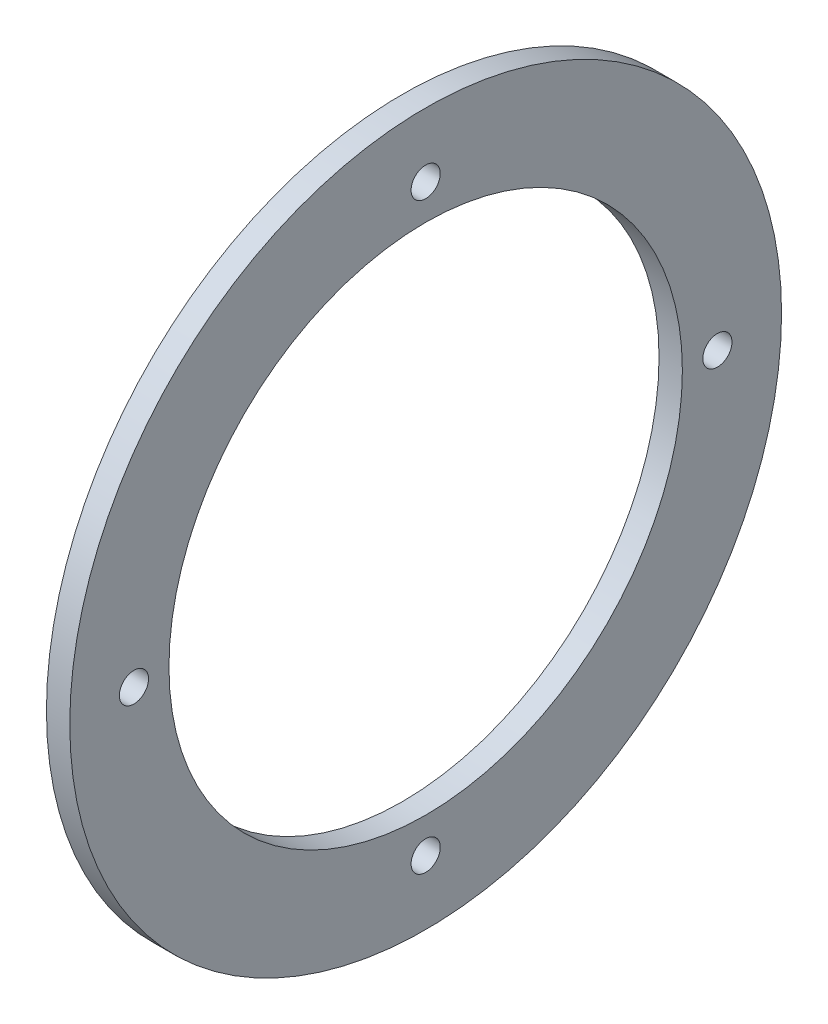
ISO-10303-21;
HEADER;
FILE_DESCRIPTION(('STEP AP214'),'2;1');
FILE_NAME('part.step','',(''),(''),'','','');
FILE_SCHEMA(('AUTOMOTIVE_DESIGN { 1 0 10303 214 1 1 1 1 }'));
ENDSEC;
DATA;
#1=APPLICATION_CONTEXT('core data for automotive mechanical design processes');
#2=APPLICATION_PROTOCOL_DEFINITION('international standard','automotive_design',2000,#1);
#3=PRODUCT_CONTEXT('',#1,'mechanical');
#4=PRODUCT('Part','Part','',(#3));
#5=PRODUCT_RELATED_PRODUCT_CATEGORY('part','',(#4));
#6=PRODUCT_DEFINITION_FORMATION('','',#4);
#7=PRODUCT_DEFINITION_CONTEXT('part definition',#1,'design');
#8=PRODUCT_DEFINITION('design','',#6,#7);
#9=PRODUCT_DEFINITION_SHAPE('','',#8);
#10=(LENGTH_UNIT() NAMED_UNIT(*) SI_UNIT(.MILLI.,.METRE.));
#11=(NAMED_UNIT(*) PLANE_ANGLE_UNIT() SI_UNIT($,.RADIAN.));
#12=(NAMED_UNIT(*) SI_UNIT($,.STERADIAN.) SOLID_ANGLE_UNIT());
#13=UNCERTAINTY_MEASURE_WITH_UNIT(LENGTH_MEASURE(1.E-05),#10,'distance_accuracy_value','');
#14=(GEOMETRIC_REPRESENTATION_CONTEXT(3) GLOBAL_UNCERTAINTY_ASSIGNED_CONTEXT((#13)) GLOBAL_UNIT_ASSIGNED_CONTEXT((#10,
#11,#12)) REPRESENTATION_CONTEXT('',''));
#15=CARTESIAN_POINT('',(0.,0.,0.));
#16=DIRECTION('',(0.,0.,1.));
#17=DIRECTION('',(1.,0.,0.));
#18=AXIS2_PLACEMENT_3D('',#15,#16,#17);
#19=CARTESIAN_POINT('',(4.,0.,0.));
#20=DIRECTION('',(-1.,0.,0.));
#21=DIRECTION('',(0.,0.,1.));
#22=AXIS2_PLACEMENT_3D('',#19,#20,#21);
#23=CYLINDRICAL_SURFACE('',#22,61.);
#24=CARTESIAN_POINT('',(4.,0.,0.));
#25=DIRECTION('',(1.,0.,0.));
#26=DIRECTION('',(0.,0.,-1.));
#27=AXIS2_PLACEMENT_3D('',#24,#25,#26);
#28=CIRCLE('',#27,61.);
#29=CARTESIAN_POINT('',(4.,0.,-61.));
#30=VERTEX_POINT('',#29);
#31=EDGE_CURVE('E42',#30,#30,#28,.T.);
#32=ORIENTED_EDGE('',*,*,#31,.F.);
#33=EDGE_LOOP('',(#32));
#34=FACE_BOUND('',#33,.T.);
#35=CARTESIAN_POINT('',(0.,0.,0.));
#36=DIRECTION('',(1.,0.,0.));
#37=DIRECTION('',(0.,0.,-1.));
#38=AXIS2_PLACEMENT_3D('',#35,#36,#37);
#39=CIRCLE('',#38,61.);
#40=CARTESIAN_POINT('',(0.,0.,-61.));
#41=VERTEX_POINT('',#40);
#42=EDGE_CURVE('E62',#41,#41,#39,.T.);
#43=ORIENTED_EDGE('',*,*,#42,.T.);
#44=EDGE_LOOP('',(#43));
#45=FACE_BOUND('',#44,.T.);
#46=ADVANCED_FACE('F34',(#34,#45),#23,.T.);
#47=CARTESIAN_POINT('',(4.,0.,0.));
#48=DIRECTION('',(-1.,0.,0.));
#49=DIRECTION('',(0.,0.,1.));
#50=AXIS2_PLACEMENT_3D('',#47,#48,#49);
#51=CYLINDRICAL_SURFACE('',#50,44.);
#52=CARTESIAN_POINT('',(4.,0.,0.));
#53=DIRECTION('',(1.,0.,0.));
#54=DIRECTION('',(0.,0.,-1.));
#55=AXIS2_PLACEMENT_3D('',#52,#53,#54);
#56=CIRCLE('',#55,44.);
#57=CARTESIAN_POINT('',(4.,0.,-44.));
#58=VERTEX_POINT('',#57);
#59=EDGE_CURVE('E47',#58,#58,#56,.T.);
#60=ORIENTED_EDGE('',*,*,#59,.T.);
#61=EDGE_LOOP('',(#60));
#62=FACE_BOUND('',#61,.T.);
#63=CARTESIAN_POINT('',(0.,0.,0.));
#64=DIRECTION('',(1.,0.,0.));
#65=DIRECTION('',(0.,0.,-1.));
#66=AXIS2_PLACEMENT_3D('',#63,#64,#65);
#67=CIRCLE('',#66,44.);
#68=CARTESIAN_POINT('',(0.,0.,-44.));
#69=VERTEX_POINT('',#68);
#70=EDGE_CURVE('E60',#69,#69,#67,.T.);
#71=ORIENTED_EDGE('',*,*,#70,.F.);
#72=EDGE_LOOP('',(#71));
#73=FACE_BOUND('',#72,.T.);
#74=ADVANCED_FACE('F83',(#62,#73),#51,.F.);
#75=CARTESIAN_POINT('',(4.,50.,0.));
#76=DIRECTION('',(-1.,0.,0.));
#77=DIRECTION('',(0.,0.,1.));
#78=AXIS2_PLACEMENT_3D('',#75,#76,#77);
#79=CYLINDRICAL_SURFACE('',#78,2.49999999999997);
#80=CARTESIAN_POINT('',(4.,50.,0.));
#81=DIRECTION('',(1.,0.,0.));
#82=DIRECTION('',(0.,0.,-1.));
#83=AXIS2_PLACEMENT_3D('',#80,#81,#82);
#84=CIRCLE('',#83,2.49999999999997);
#85=CARTESIAN_POINT('',(4.,50.,-2.49999999999995));
#86=VERTEX_POINT('',#85);
#87=EDGE_CURVE('E76',#86,#86,#84,.F.);
#88=ORIENTED_EDGE('',*,*,#87,.F.);
#89=EDGE_LOOP('',(#88));
#90=FACE_BOUND('',#89,.T.);
#91=CARTESIAN_POINT('',(0.,50.,0.));
#92=DIRECTION('',(1.,0.,0.));
#93=DIRECTION('',(0.,0.,-1.));
#94=AXIS2_PLACEMENT_3D('',#91,#92,#93);
#95=CIRCLE('',#94,2.49999999999997);
#96=CARTESIAN_POINT('',(0.,50.,-2.49999999999995));
#97=VERTEX_POINT('',#96);
#98=EDGE_CURVE('E57',#97,#97,#95,.F.);
#99=ORIENTED_EDGE('',*,*,#98,.T.);
#100=EDGE_LOOP('',(#99));
#101=FACE_BOUND('',#100,.T.);
#102=ADVANCED_FACE('F100',(#90,#101),#79,.F.);
#103=CARTESIAN_POINT('',(4.,0.,-50.));
#104=DIRECTION('',(-1.,0.,0.));
#105=DIRECTION('',(0.,0.,1.));
#106=AXIS2_PLACEMENT_3D('',#103,#104,#105);
#107=CYLINDRICAL_SURFACE('',#106,2.49999999999999);
#108=CARTESIAN_POINT('',(4.,0.,-50.));
#109=DIRECTION('',(1.,0.,0.));
#110=DIRECTION('',(0.,0.,-1.));
#111=AXIS2_PLACEMENT_3D('',#108,#109,#110);
#112=CIRCLE('',#111,2.49999999999999);
#113=CARTESIAN_POINT('',(4.,0.,-52.5));
#114=VERTEX_POINT('',#113);
#115=EDGE_CURVE('E71',#114,#114,#112,.T.);
#116=ORIENTED_EDGE('',*,*,#115,.T.);
#117=EDGE_LOOP('',(#116));
#118=FACE_BOUND('',#117,.T.);
#119=CARTESIAN_POINT('',(0.,0.,-50.));
#120=DIRECTION('',(1.,0.,0.));
#121=DIRECTION('',(0.,0.,-1.));
#122=AXIS2_PLACEMENT_3D('',#119,#120,#121);
#123=CIRCLE('',#122,2.49999999999999);
#124=CARTESIAN_POINT('',(0.,0.,-52.5));
#125=VERTEX_POINT('',#124);
#126=EDGE_CURVE('E54',#125,#125,#123,.T.);
#127=ORIENTED_EDGE('',*,*,#126,.F.);
#128=EDGE_LOOP('',(#127));
#129=FACE_BOUND('',#128,.T.);
#130=ADVANCED_FACE('F106',(#118,#129),#107,.F.);
#131=CARTESIAN_POINT('',(4.,-50.,0.));
#132=DIRECTION('',(-1.,0.,0.));
#133=DIRECTION('',(0.,0.,1.));
#134=AXIS2_PLACEMENT_3D('',#131,#132,#133);
#135=CYLINDRICAL_SURFACE('',#134,2.5);
#136=CARTESIAN_POINT('',(4.,-50.,0.));
#137=DIRECTION('',(1.,0.,0.));
#138=DIRECTION('',(0.,0.,-1.));
#139=AXIS2_PLACEMENT_3D('',#136,#137,#138);
#140=CIRCLE('',#139,2.5);
#141=CARTESIAN_POINT('',(4.,-50.,-2.5));
#142=VERTEX_POINT('',#141);
#143=EDGE_CURVE('E67',#142,#142,#140,.T.);
#144=ORIENTED_EDGE('',*,*,#143,.T.);
#145=EDGE_LOOP('',(#144));
#146=FACE_BOUND('',#145,.T.);
#147=CARTESIAN_POINT('',(0.,-50.,0.));
#148=DIRECTION('',(1.,0.,0.));
#149=DIRECTION('',(0.,0.,-1.));
#150=AXIS2_PLACEMENT_3D('',#147,#148,#149);
#151=CIRCLE('',#150,2.5);
#152=CARTESIAN_POINT('',(0.,-50.,-2.5));
#153=VERTEX_POINT('',#152);
#154=EDGE_CURVE('E51',#153,#153,#151,.T.);
#155=ORIENTED_EDGE('',*,*,#154,.F.);
#156=EDGE_LOOP('',(#155));
#157=FACE_BOUND('',#156,.T.);
#158=ADVANCED_FACE('F36',(#146,#157),#135,.F.);
#159=CARTESIAN_POINT('',(4.,0.,50.));
#160=DIRECTION('',(-1.,0.,0.));
#161=DIRECTION('',(0.,0.,1.));
#162=AXIS2_PLACEMENT_3D('',#159,#160,#161);
#163=CYLINDRICAL_SURFACE('',#162,2.49999999999999);
#164=CARTESIAN_POINT('',(4.,0.,50.));
#165=DIRECTION('',(1.,0.,0.));
#166=DIRECTION('',(0.,0.,-1.));
#167=AXIS2_PLACEMENT_3D('',#164,#165,#166);
#168=CIRCLE('',#167,2.49999999999999);
#169=CARTESIAN_POINT('',(4.,0.,47.5));
#170=VERTEX_POINT('',#169);
#171=EDGE_CURVE('E10',#170,#170,#168,.F.);
#172=ORIENTED_EDGE('',*,*,#171,.F.);
#173=EDGE_LOOP('',(#172));
#174=FACE_BOUND('',#173,.T.);
#175=CARTESIAN_POINT('',(0.,0.,50.));
#176=DIRECTION('',(1.,0.,0.));
#177=DIRECTION('',(0.,0.,-1.));
#178=AXIS2_PLACEMENT_3D('',#175,#176,#177);
#179=CIRCLE('',#178,2.49999999999999);
#180=CARTESIAN_POINT('',(0.,0.,47.5));
#181=VERTEX_POINT('',#180);
#182=EDGE_CURVE('E38',#181,#181,#179,.F.);
#183=ORIENTED_EDGE('',*,*,#182,.T.);
#184=EDGE_LOOP('',(#183));
#185=FACE_BOUND('',#184,.T.);
#186=ADVANCED_FACE('F90',(#174,#185),#163,.F.);
#187=CARTESIAN_POINT('',(4.,0.,0.));
#188=DIRECTION('',(1.,0.,0.));
#189=DIRECTION('',(0.,0.,-1.));
#190=AXIS2_PLACEMENT_3D('',#187,#188,#189);
#191=PLANE('',#190);
#192=ORIENTED_EDGE('',*,*,#143,.F.);
#193=EDGE_LOOP('',(#192));
#194=FACE_BOUND('',#193,.T.);
#195=ORIENTED_EDGE('',*,*,#115,.F.);
#196=EDGE_LOOP('',(#195));
#197=FACE_BOUND('',#196,.T.);
#198=ORIENTED_EDGE('',*,*,#87,.T.);
#199=EDGE_LOOP('',(#198));
#200=FACE_BOUND('',#199,.T.);
#201=ORIENTED_EDGE('',*,*,#59,.F.);
#202=EDGE_LOOP('',(#201));
#203=FACE_BOUND('',#202,.T.);
#204=ORIENTED_EDGE('',*,*,#31,.T.);
#205=EDGE_LOOP('',(#204));
#206=FACE_BOUND('',#205,.T.);
#207=ORIENTED_EDGE('',*,*,#171,.T.);
#208=EDGE_LOOP('',(#207));
#209=FACE_BOUND('',#208,.T.);
#210=ADVANCED_FACE('F86',(#194,#197,#200,#203,#206,#209),#191,.T.);
#211=CARTESIAN_POINT('',(0.,0.,0.));
#212=DIRECTION('',(1.,0.,0.));
#213=DIRECTION('',(0.,0.,-1.));
#214=AXIS2_PLACEMENT_3D('',#211,#212,#213);
#215=PLANE('',#214);
#216=ORIENTED_EDGE('',*,*,#154,.T.);
#217=EDGE_LOOP('',(#216));
#218=FACE_BOUND('',#217,.T.);
#219=ORIENTED_EDGE('',*,*,#126,.T.);
#220=EDGE_LOOP('',(#219));
#221=FACE_BOUND('',#220,.T.);
#222=ORIENTED_EDGE('',*,*,#98,.F.);
#223=EDGE_LOOP('',(#222));
#224=FACE_BOUND('',#223,.T.);
#225=ORIENTED_EDGE('',*,*,#70,.T.);
#226=EDGE_LOOP('',(#225));
#227=FACE_BOUND('',#226,.T.);
#228=ORIENTED_EDGE('',*,*,#42,.F.);
#229=EDGE_LOOP('',(#228));
#230=FACE_BOUND('',#229,.T.);
#231=ORIENTED_EDGE('',*,*,#182,.F.);
#232=EDGE_LOOP('',(#231));
#233=FACE_BOUND('',#232,.T.);
#234=ADVANCED_FACE('F89',(#218,#221,#224,#227,#230,#233),#215,.F.);
#235=CLOSED_SHELL('',(#46,#74,#102,#130,#158,#186,#210,#234));
#236=MANIFOLD_SOLID_BREP('B2',#235);
#237=ADVANCED_BREP_SHAPE_REPRESENTATION('',(#18,#236),#14);
#238=SHAPE_DEFINITION_REPRESENTATION(#9,#237);
ENDSEC;
END-ISO-10303-21;
